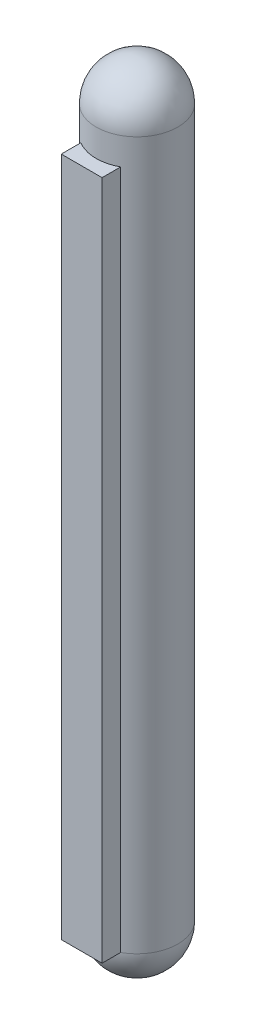
ISO-10303-21;
HEADER;
FILE_DESCRIPTION(('STEP AP214'),'2;1');
FILE_NAME('part.step','',(''),(''),'','','');
FILE_SCHEMA(('AUTOMOTIVE_DESIGN { 1 0 10303 214 1 1 1 1 }'));
ENDSEC;
DATA;
#1=APPLICATION_CONTEXT('core data for automotive mechanical design processes');
#2=APPLICATION_PROTOCOL_DEFINITION('international standard','automotive_design',2000,#1);
#3=PRODUCT_CONTEXT('',#1,'mechanical');
#4=PRODUCT('Part','Part','',(#3));
#5=PRODUCT_RELATED_PRODUCT_CATEGORY('part','',(#4));
#6=PRODUCT_DEFINITION_FORMATION('','',#4);
#7=PRODUCT_DEFINITION_CONTEXT('part definition',#1,'design');
#8=PRODUCT_DEFINITION('design','',#6,#7);
#9=PRODUCT_DEFINITION_SHAPE('','',#8);
#10=(LENGTH_UNIT() NAMED_UNIT(*) SI_UNIT(.MILLI.,.METRE.));
#11=(NAMED_UNIT(*) PLANE_ANGLE_UNIT() SI_UNIT($,.RADIAN.));
#12=(NAMED_UNIT(*) SI_UNIT($,.STERADIAN.) SOLID_ANGLE_UNIT());
#13=UNCERTAINTY_MEASURE_WITH_UNIT(LENGTH_MEASURE(1.E-05),#10,'distance_accuracy_value','');
#14=(GEOMETRIC_REPRESENTATION_CONTEXT(3) GLOBAL_UNCERTAINTY_ASSIGNED_CONTEXT((#13)) GLOBAL_UNIT_ASSIGNED_CONTEXT((#10,
#11,#12)) REPRESENTATION_CONTEXT('',''));
#15=CARTESIAN_POINT('',(0.,0.,0.));
#16=DIRECTION('',(0.,0.,1.));
#17=DIRECTION('',(1.,0.,0.));
#18=AXIS2_PLACEMENT_3D('',#15,#16,#17);
#19=CARTESIAN_POINT('',(-1.566916873849,-25.,0.));
#20=DIRECTION('',(0.,-1.,0.));
#21=DIRECTION('',(0.,0.,-1.));
#22=AXIS2_PLACEMENT_3D('',#19,#20,#21);
#23=PLANE('',#22);
#24=CARTESIAN_POINT('',(0.,-25.,0.));
#25=DIRECTION('',(0.,-1.,0.));
#26=DIRECTION('',(-0.522305624616324,0.,0.852758368175975));
#27=AXIS2_PLACEMENT_3D('',#24,#25,#26);
#28=CIRCLE('',#27,3.);
#29=CARTESIAN_POINT('',(1.433083126151,-25.,2.63557825790497));
#30=VERTEX_POINT('',#29);
#31=CARTESIAN_POINT('',(0.,-25.,3.));
#32=VERTEX_POINT('',#31);
#33=EDGE_CURVE('E141',#30,#32,#28,.T.);
#34=ORIENTED_EDGE('',*,*,#33,.F.);
#35=DIRECTION('',(0.,0.,1.));
#36=VECTOR('',#35,1.);
#37=CARTESIAN_POINT('',(1.433083126151,-25.,0.));
#38=LINE('',#37,#36);
#39=CARTESIAN_POINT('',(1.433083126151,-25.,4.));
#40=VERTEX_POINT('',#39);
#41=EDGE_CURVE('E119',#30,#40,#38,.T.);
#42=ORIENTED_EDGE('',*,*,#41,.T.);
#43=DIRECTION('',(1.,0.,0.));
#44=VECTOR('',#43,1.);
#45=CARTESIAN_POINT('',(0.,-25.,4.));
#46=LINE('',#45,#44);
#47=CARTESIAN_POINT('',(-1.566916873849,-25.,4.));
#48=VERTEX_POINT('',#47);
#49=EDGE_CURVE('E11',#48,#40,#46,.T.);
#50=ORIENTED_EDGE('',*,*,#49,.F.);
#51=DIRECTION('',(0.,0.,-1.));
#52=VECTOR('',#51,1.);
#53=CARTESIAN_POINT('',(-1.566916873849,-25.,0.));
#54=LINE('',#53,#52);
#55=CARTESIAN_POINT('',(-1.566916873849,-25.,2.55827510452795));
#56=VERTEX_POINT('',#55);
#57=EDGE_CURVE('E108',#48,#56,#54,.T.);
#58=ORIENTED_EDGE('',*,*,#57,.T.);
#59=CARTESIAN_POINT('',(0.,-25.,0.));
#60=DIRECTION('',(0.,-1.,0.));
#61=DIRECTION('',(-0.522305624616324,0.,0.852758368175975));
#62=AXIS2_PLACEMENT_3D('',#59,#60,#61);
#63=CIRCLE('',#62,3.);
#64=EDGE_CURVE('E111',#32,#56,#63,.T.);
#65=ORIENTED_EDGE('',*,*,#64,.F.);
#66=EDGE_LOOP('',(#34,#42,#50,#58,#65));
#67=FACE_BOUND('',#66,.T.);
#68=ADVANCED_FACE('F17',(#67),#23,.T.);
#69=CARTESIAN_POINT('',(0.,0.,4.));
#70=DIRECTION('',(0.,0.,1.));
#71=DIRECTION('',(1.,0.,0.));
#72=AXIS2_PLACEMENT_3D('',#69,#70,#71);
#73=PLANE('',#72);
#74=ORIENTED_EDGE('',*,*,#49,.T.);
#75=DIRECTION('',(0.,-1.,0.));
#76=VECTOR('',#75,1.);
#77=CARTESIAN_POINT('',(1.433083126151,-25.,4.));
#78=LINE('',#77,#76);
#79=CARTESIAN_POINT('',(1.433083126151,25.,4.));
#80=VERTEX_POINT('',#79);
#81=EDGE_CURVE('E170',#80,#40,#78,.T.);
#82=ORIENTED_EDGE('',*,*,#81,.F.);
#83=DIRECTION('',(1.,0.,0.));
#84=VECTOR('',#83,1.);
#85=CARTESIAN_POINT('',(1.433083126151,25.,4.));
#86=LINE('',#85,#84);
#87=CARTESIAN_POINT('',(-1.566916873849,25.,4.));
#88=VERTEX_POINT('',#87);
#89=EDGE_CURVE('E113',#88,#80,#86,.T.);
#90=ORIENTED_EDGE('',*,*,#89,.F.);
#91=DIRECTION('',(0.,1.,0.));
#92=VECTOR('',#91,1.);
#93=CARTESIAN_POINT('',(-1.566916873849,25.,4.));
#94=LINE('',#93,#92);
#95=EDGE_CURVE('E28',#48,#88,#94,.T.);
#96=ORIENTED_EDGE('',*,*,#95,.F.);
#97=EDGE_LOOP('',(#74,#82,#90,#96));
#98=FACE_BOUND('',#97,.T.);
#99=ADVANCED_FACE('F181',(#98),#73,.T.);
#100=CARTESIAN_POINT('',(-1.566916873849,25.,0.));
#101=DIRECTION('',(-1.,0.,0.));
#102=DIRECTION('',(0.,0.,1.));
#103=AXIS2_PLACEMENT_3D('',#100,#101,#102);
#104=PLANE('',#103);
#105=DIRECTION('',(0.,0.,1.));
#106=VECTOR('',#105,1.);
#107=CARTESIAN_POINT('',(-1.566916873849,25.,0.));
#108=LINE('',#107,#106);
#109=CARTESIAN_POINT('',(-1.56691687384898,25.,2.55827510452792));
#110=VERTEX_POINT('',#109);
#111=EDGE_CURVE('E104',#110,#88,#108,.T.);
#112=ORIENTED_EDGE('',*,*,#111,.F.);
#113=DIRECTION('',(0.,1.,0.));
#114=VECTOR('',#113,1.);
#115=CARTESIAN_POINT('',(-1.56691687384896,32.9,2.55827510452793));
#116=LINE('',#115,#114);
#117=EDGE_CURVE('E122',#56,#110,#116,.T.);
#118=ORIENTED_EDGE('',*,*,#117,.F.);
#119=ORIENTED_EDGE('',*,*,#57,.F.);
#120=ORIENTED_EDGE('',*,*,#95,.T.);
#121=EDGE_LOOP('',(#112,#118,#119,#120));
#122=FACE_BOUND('',#121,.T.);
#123=ADVANCED_FACE('F123',(#122),#104,.T.);
#124=CARTESIAN_POINT('',(1.433083126151,25.,0.));
#125=DIRECTION('',(0.,1.,0.));
#126=DIRECTION('',(1.,0.,0.));
#127=AXIS2_PLACEMENT_3D('',#124,#125,#126);
#128=PLANE('',#127);
#129=DIRECTION('',(0.,0.,1.));
#130=VECTOR('',#129,1.);
#131=CARTESIAN_POINT('',(1.433083126151,25.,0.));
#132=LINE('',#131,#130);
#133=CARTESIAN_POINT('',(1.43308312615099,25.,2.63557825790495));
#134=VERTEX_POINT('',#133);
#135=EDGE_CURVE('E78',#134,#80,#132,.T.);
#136=ORIENTED_EDGE('',*,*,#135,.F.);
#137=CARTESIAN_POINT('',(0.,25.,0.));
#138=DIRECTION('',(0.,1.,0.));
#139=DIRECTION('',(0.,0.,-1.));
#140=AXIS2_PLACEMENT_3D('',#137,#138,#139);
#141=CIRCLE('',#140,3.);
#142=CARTESIAN_POINT('',(0.,25.,3.));
#143=VERTEX_POINT('',#142);
#144=EDGE_CURVE('E21',#143,#134,#141,.T.);
#145=ORIENTED_EDGE('',*,*,#144,.F.);
#146=CARTESIAN_POINT('',(0.,25.,0.));
#147=DIRECTION('',(0.,1.,0.));
#148=DIRECTION('',(0.,0.,-1.));
#149=AXIS2_PLACEMENT_3D('',#146,#147,#148);
#150=CIRCLE('',#149,3.);
#151=EDGE_CURVE('E127',#110,#143,#150,.T.);
#152=ORIENTED_EDGE('',*,*,#151,.F.);
#153=ORIENTED_EDGE('',*,*,#111,.T.);
#154=ORIENTED_EDGE('',*,*,#89,.T.);
#155=EDGE_LOOP('',(#136,#145,#152,#153,#154));
#156=FACE_BOUND('',#155,.T.);
#157=ADVANCED_FACE('F162',(#156),#128,.T.);
#158=CARTESIAN_POINT('',(1.433083126151,-25.,0.));
#159=DIRECTION('',(1.,0.,0.));
#160=DIRECTION('',(0.,1.,0.));
#161=AXIS2_PLACEMENT_3D('',#158,#159,#160);
#162=PLANE('',#161);
#163=ORIENTED_EDGE('',*,*,#41,.F.);
#164=DIRECTION('',(0.,-1.,0.));
#165=VECTOR('',#164,1.);
#166=CARTESIAN_POINT('',(1.43308312615098,32.9,2.63557825790496));
#167=LINE('',#166,#165);
#168=EDGE_CURVE('E132',#134,#30,#167,.T.);
#169=ORIENTED_EDGE('',*,*,#168,.F.);
#170=ORIENTED_EDGE('',*,*,#135,.T.);
#171=ORIENTED_EDGE('',*,*,#81,.T.);
#172=EDGE_LOOP('',(#163,#169,#170,#171));
#173=FACE_BOUND('',#172,.T.);
#174=ADVANCED_FACE('F179',(#173),#162,.T.);
#175=CARTESIAN_POINT('',(0.,-25.,0.));
#176=DIRECTION('',(0.,1.,0.));
#177=DIRECTION('',(0.,0.,-1.));
#178=AXIS2_PLACEMENT_3D('',#175,#176,#177);
#179=SPHERICAL_SURFACE('',#178,3.);
#180=CARTESIAN_POINT('',(0.,-25.,0.));
#181=DIRECTION('',(0.,1.,0.));
#182=DIRECTION('',(0.,0.,-1.));
#183=AXIS2_PLACEMENT_3D('',#180,#181,#182);
#184=CIRCLE('',#183,3.);
#185=EDGE_CURVE('E117',#30,#56,#184,.T.);
#186=ORIENTED_EDGE('',*,*,#185,.F.);
#187=ORIENTED_EDGE('',*,*,#33,.T.);
#188=CARTESIAN_POINT('',(0.,-25.,0.));
#189=DIRECTION('',(1.,0.,0.));
#190=DIRECTION('',(0.,0.,1.));
#191=AXIS2_PLACEMENT_3D('',#188,#189,#190);
#192=CIRCLE('',#191,3.);
#193=CARTESIAN_POINT('',(0.,-28.,0.));
#194=VERTEX_POINT('',#193);
#195=EDGE_CURVE('E96',#32,#194,#192,.T.);
#196=ORIENTED_EDGE('',*,*,#195,.T.);
#197=ORIENTED_EDGE('',*,*,#195,.F.);
#198=ORIENTED_EDGE('',*,*,#64,.T.);
#199=EDGE_LOOP('',(#186,#187,#196,#197,#198));
#200=FACE_BOUND('',#199,.T.);
#201=ADVANCED_FACE('F19',(#200),#179,.T.);
#202=CARTESIAN_POINT('',(0.,27.,0.));
#203=DIRECTION('',(0.,1.,0.));
#204=DIRECTION('',(0.,0.,-1.));
#205=AXIS2_PLACEMENT_3D('',#202,#203,#204);
#206=SPHERICAL_SURFACE('',#205,3.);
#207=CARTESIAN_POINT('',(0.,27.,0.));
#208=DIRECTION('',(0.,-1.,0.));
#209=DIRECTION('',(0.,0.,-1.));
#210=AXIS2_PLACEMENT_3D('',#207,#208,#209);
#211=CIRCLE('',#210,3.);
#212=CARTESIAN_POINT('',(0.,27.,3.));
#213=VERTEX_POINT('',#212);
#214=EDGE_CURVE('E148',#213,#213,#211,.T.);
#215=ORIENTED_EDGE('',*,*,#214,.F.);
#216=CARTESIAN_POINT('',(0.,27.,0.));
#217=DIRECTION('',(1.,0.,0.));
#218=DIRECTION('',(0.,0.,1.));
#219=AXIS2_PLACEMENT_3D('',#216,#217,#218);
#220=CIRCLE('',#219,3.);
#221=CARTESIAN_POINT('',(0.,30.,0.));
#222=VERTEX_POINT('',#221);
#223=EDGE_CURVE('E63',#222,#213,#220,.T.);
#224=ORIENTED_EDGE('',*,*,#223,.F.);
#225=ORIENTED_EDGE('',*,*,#223,.T.);
#226=EDGE_LOOP('',(#215,#224,#225));
#227=FACE_BOUND('',#226,.T.);
#228=ADVANCED_FACE('F200',(#227),#206,.T.);
#229=CARTESIAN_POINT('',(0.,32.9,0.));
#230=DIRECTION('',(0.,-1.,0.));
#231=DIRECTION('',(0.,0.,-1.));
#232=AXIS2_PLACEMENT_3D('',#229,#230,#231);
#233=CYLINDRICAL_SURFACE('',#232,3.);
#234=ORIENTED_EDGE('',*,*,#185,.T.);
#235=ORIENTED_EDGE('',*,*,#117,.T.);
#236=ORIENTED_EDGE('',*,*,#151,.T.);
#237=DIRECTION('',(0.,1.,0.));
#238=VECTOR('',#237,1.);
#239=CARTESIAN_POINT('',(0.,32.9,3.));
#240=LINE('',#239,#238);
#241=EDGE_CURVE('E144',#143,#213,#240,.T.);
#242=ORIENTED_EDGE('',*,*,#241,.T.);
#243=ORIENTED_EDGE('',*,*,#214,.T.);
#244=ORIENTED_EDGE('',*,*,#241,.F.);
#245=ORIENTED_EDGE('',*,*,#144,.T.);
#246=ORIENTED_EDGE('',*,*,#168,.T.);
#247=EDGE_LOOP('',(#234,#235,#236,#242,#243,#244,#245,#246));
#248=FACE_BOUND('',#247,.T.);
#249=ADVANCED_FACE('F130',(#248),#233,.T.);
#250=CLOSED_SHELL('',(#68,#99,#123,#157,#174,#201,#228,#249));
#251=MANIFOLD_SOLID_BREP('B1',#250);
#252=ADVANCED_BREP_SHAPE_REPRESENTATION('',(#18,#251),#14);
#253=SHAPE_DEFINITION_REPRESENTATION(#9,#252);
ENDSEC;
END-ISO-10303-21;
